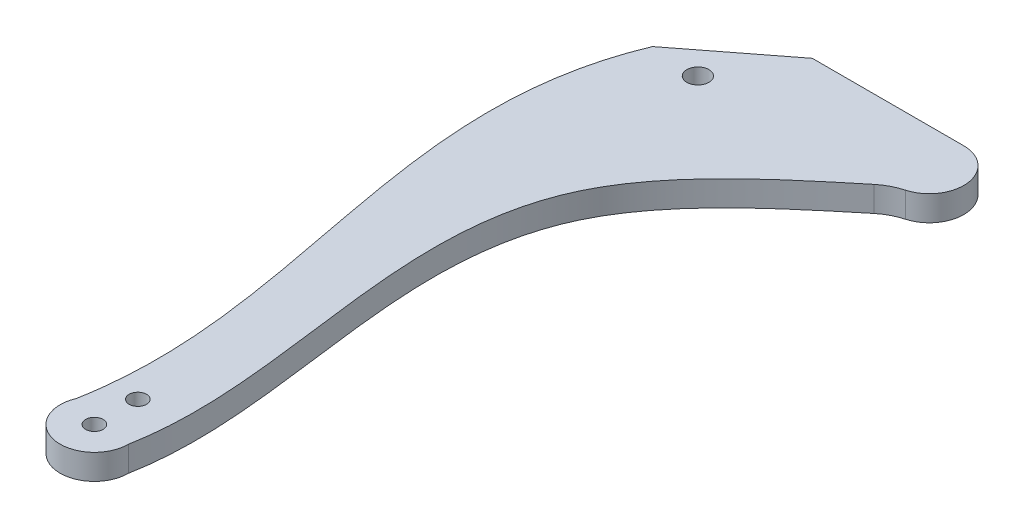
ISO-10303-21;
HEADER;
FILE_DESCRIPTION(('STEP AP214'),'2;1');
FILE_NAME('part.step','',(''),(''),'','','');
FILE_SCHEMA(('AUTOMOTIVE_DESIGN { 1 0 10303 214 1 1 1 1 }'));
ENDSEC;
DATA;
#1=APPLICATION_CONTEXT('core data for automotive mechanical design processes');
#2=APPLICATION_PROTOCOL_DEFINITION('international standard','automotive_design',2000,#1);
#3=PRODUCT_CONTEXT('',#1,'mechanical');
#4=PRODUCT('Part','Part','',(#3));
#5=PRODUCT_RELATED_PRODUCT_CATEGORY('part','',(#4));
#6=PRODUCT_DEFINITION_FORMATION('','',#4);
#7=PRODUCT_DEFINITION_CONTEXT('part definition',#1,'design');
#8=PRODUCT_DEFINITION('design','',#6,#7);
#9=PRODUCT_DEFINITION_SHAPE('','',#8);
#10=(LENGTH_UNIT() NAMED_UNIT(*) SI_UNIT(.MILLI.,.METRE.));
#11=(NAMED_UNIT(*) PLANE_ANGLE_UNIT() SI_UNIT($,.RADIAN.));
#12=(NAMED_UNIT(*) SI_UNIT($,.STERADIAN.) SOLID_ANGLE_UNIT());
#13=UNCERTAINTY_MEASURE_WITH_UNIT(LENGTH_MEASURE(1.E-05),#10,'distance_accuracy_value','');
#14=(GEOMETRIC_REPRESENTATION_CONTEXT(3) GLOBAL_UNCERTAINTY_ASSIGNED_CONTEXT((#13)) GLOBAL_UNIT_ASSIGNED_CONTEXT((#10,
#11,#12)) REPRESENTATION_CONTEXT('',''));
#15=CARTESIAN_POINT('',(0.,0.,0.));
#16=DIRECTION('',(0.,0.,1.));
#17=DIRECTION('',(1.,0.,0.));
#18=AXIS2_PLACEMENT_3D('',#15,#16,#17);
#19=CARTESIAN_POINT('',(-33.5800678442369,4.5,56.28156678213));
#20=DIRECTION('',(0.,-1.,0.));
#21=DIRECTION('',(0.,0.,-1.));
#22=AXIS2_PLACEMENT_3D('',#19,#20,#21);
#23=PLANE('',#22);
#24=CARTESIAN_POINT('',(-23.6205551146785,4.5,112.138995974269));
#25=DIRECTION('',(0.,1.,0.));
#26=DIRECTION('',(0.,0.,1.));
#27=AXIS2_PLACEMENT_3D('',#24,#25,#26);
#28=CIRCLE('',#27,1.554999938);
#29=CARTESIAN_POINT('',(-23.6205551146785,4.5,113.693995912269));
#30=VERTEX_POINT('',#29);
#31=EDGE_CURVE('E194',#30,#30,#28,.T.);
#32=ORIENTED_EDGE('',*,*,#31,.F.);
#33=EDGE_LOOP('',(#32));
#34=FACE_BOUND('',#33,.T.);
#35=DIRECTION('',(-0.79076812279447,0.,0.612115819083374));
#36=VECTOR('',#35,1.);
#37=CARTESIAN_POINT('',(-16.1448996631949,4.5,-8.4540032736779));
#38=LINE('',#37,#36);
#39=CARTESIAN_POINT('',(-16.1448996631949,4.5,-8.4540032736779));
#40=VERTEX_POINT('',#39);
#41=CARTESIAN_POINT('',(-32.217521916136,4.5,3.98745213098542));
#42=VERTEX_POINT('',#41);
#43=EDGE_CURVE('E147',#40,#42,#38,.T.);
#44=ORIENTED_EDGE('',*,*,#43,.T.);
#45=CARTESIAN_POINT('',(-32.217521916136,4.5,3.98745213098542));
#46=CARTESIAN_POINT('',(-42.2065149060718,4.5,27.8278205053542));
#47=CARTESIAN_POINT('',(-29.5613701153101,4.5,63.9822503451925));
#48=CARTESIAN_POINT('',(-27.3901690543069,4.5,99.6650419871978));
#49=CARTESIAN_POINT('',(-29.2394941851879,4.5,109.757437382177));
#50=B_SPLINE_CURVE_WITH_KNOTS('',3,(#45,#46,#47,#48,#49),.UNSPECIFIED.,.F.,.F.,(4,1,4),(0.,
0.696305278791168,0.977824200877543),.UNSPECIFIED.);
#51=CARTESIAN_POINT('',(-29.2394941851879,4.5,109.757437382177));
#52=VERTEX_POINT('',#51);
#53=EDGE_CURVE('E90',#42,#52,#50,.T.);
#54=ORIENTED_EDGE('',*,*,#53,.T.);
#55=CARTESIAN_POINT('',(-23.6205551146785,4.5,112.138995974269));
#56=DIRECTION('',(0.,1.,0.));
#57=DIRECTION('',(0.,0.,1.));
#58=AXIS2_PLACEMENT_3D('',#55,#56,#57);
#59=CIRCLE('',#58,6.10281063164049);
#60=CARTESIAN_POINT('',(-17.517744483038,4.5,112.138995974269));
#61=VERTEX_POINT('',#60);
#62=EDGE_CURVE('E159',#52,#61,#59,.T.);
#63=ORIENTED_EDGE('',*,*,#62,.T.);
#64=CARTESIAN_POINT('',(-17.517744483038,4.5,112.138995974269));
#65=CARTESIAN_POINT('',(-12.8946829626533,4.5,87.3265466424668));
#66=CARTESIAN_POINT('',(-31.4890867813224,4.5,46.9437900593647));
#67=CARTESIAN_POINT('',(-4.6960452827572,4.5,16.5858685499804));
#68=CARTESIAN_POINT('',(4.93253274399876,4.5,8.71883291305758));
#69=CARTESIAN_POINT('',(8.82409988389271,4.5,5.51846179454827));
#70=B_SPLINE_CURVE_WITH_KNOTS('',3,(#64,#65,#66,#67,#68,#69),.UNSPECIFIED.,.F.,.F.,(4,1,1,4),
(0.0234781084162324,0.692645434763002,0.868534101728694,1.),.UNSPECIFIED.);
#71=CARTESIAN_POINT('',(8.82409988389271,4.5,5.51846179454826));
#72=VERTEX_POINT('',#71);
#73=EDGE_CURVE('E106',#61,#72,#70,.T.);
#74=ORIENTED_EDGE('',*,*,#73,.T.);
#75=CARTESIAN_POINT('',(15.1759095054056,4.5,13.2420953003573));
#76=DIRECTION('',(0.,-1.,0.));
#77=DIRECTION('',(0.,0.,1.));
#78=AXIS2_PLACEMENT_3D('',#75,#76,#77);
#79=CIRCLE('',#78,10.);
#80=CARTESIAN_POINT('',(12.5127720902824,4.5,3.60323130566523));
#81=VERTEX_POINT('',#80);
#82=EDGE_CURVE('E100',#72,#81,#79,.T.);
#83=ORIENTED_EDGE('',*,*,#82,.T.);
#84=CARTESIAN_POINT('',(10.8777451080779,4.5,-2.31452668144633));
#85=DIRECTION('',(0.,1.,0.));
#86=DIRECTION('',(0.,0.,1.));
#87=AXIS2_PLACEMENT_3D('',#84,#85,#86);
#88=CIRCLE('',#87,6.13947659223157);
#89=CARTESIAN_POINT('',(10.8777451080779,4.5,-8.4540032736779));
#90=VERTEX_POINT('',#89);
#91=EDGE_CURVE('E104',#81,#90,#88,.T.);
#92=ORIENTED_EDGE('',*,*,#91,.T.);
#93=DIRECTION('',(-1.,0.,0.));
#94=VECTOR('',#93,1.);
#95=CARTESIAN_POINT('',(-16.1448996631949,4.5,-8.4540032736779));
#96=LINE('',#95,#94);
#97=EDGE_CURVE('E50',#90,#40,#96,.T.);
#98=ORIENTED_EDGE('',*,*,#97,.T.);
#99=EDGE_LOOP('',(#44,#54,#63,#74,#83,#92,#98));
#100=FACE_BOUND('',#99,.T.);
#101=CARTESIAN_POINT('',(-23.6205551146785,4.5,4.47899590226864));
#102=DIRECTION('',(0.,1.,0.));
#103=DIRECTION('',(0.,0.,1.));
#104=AXIS2_PLACEMENT_3D('',#101,#102,#103);
#105=CIRCLE('',#104,1.97500000000001);
#106=CARTESIAN_POINT('',(-23.6205551146785,4.5,6.45399590226865));
#107=VERTEX_POINT('',#106);
#108=EDGE_CURVE('E128',#107,#107,#105,.T.);
#109=ORIENTED_EDGE('',*,*,#108,.F.);
#110=EDGE_LOOP('',(#109));
#111=FACE_BOUND('',#110,.T.);
#112=CARTESIAN_POINT('',(-23.6205551146785,4.5,104.378996000269));
#113=DIRECTION('',(0.,1.,0.));
#114=DIRECTION('',(0.,0.,1.));
#115=AXIS2_PLACEMENT_3D('',#112,#113,#114);
#116=CIRCLE('',#115,1.554999938);
#117=CARTESIAN_POINT('',(-23.6205551146785,4.5,105.933995938269));
#118=VERTEX_POINT('',#117);
#119=EDGE_CURVE('E200',#118,#118,#116,.T.);
#120=ORIENTED_EDGE('',*,*,#119,.F.);
#121=EDGE_LOOP('',(#120));
#122=FACE_BOUND('',#121,.T.);
#123=ADVANCED_FACE('F33',(#34,#100,#111,#122),#23,.F.);
#124=CARTESIAN_POINT('',(-33.5800678442369,0.,56.28156678213));
#125=DIRECTION('',(0.,-1.,0.));
#126=DIRECTION('',(0.,0.,-1.));
#127=AXIS2_PLACEMENT_3D('',#124,#125,#126);
#128=PLANE('',#127);
#129=CARTESIAN_POINT('',(-23.6205551146785,0.,112.138995974269));
#130=DIRECTION('',(0.,1.,0.));
#131=DIRECTION('',(0.,0.,1.));
#132=AXIS2_PLACEMENT_3D('',#129,#130,#131);
#133=CIRCLE('',#132,1.554999938);
#134=CARTESIAN_POINT('',(-23.6205551146785,0.,113.693995912269));
#135=VERTEX_POINT('',#134);
#136=EDGE_CURVE('E197',#135,#135,#133,.T.);
#137=ORIENTED_EDGE('',*,*,#136,.T.);
#138=EDGE_LOOP('',(#137));
#139=FACE_BOUND('',#138,.T.);
#140=DIRECTION('',(-0.79076812279447,0.,0.612115819083374));
#141=VECTOR('',#140,1.);
#142=CARTESIAN_POINT('',(-16.1448996631949,0.,-8.4540032736779));
#143=LINE('',#142,#141);
#144=CARTESIAN_POINT('',(-16.1448996631949,0.,-8.4540032736779));
#145=VERTEX_POINT('',#144);
#146=CARTESIAN_POINT('',(-32.217521916136,0.,3.98745213098542));
#147=VERTEX_POINT('',#146);
#148=EDGE_CURVE('E124',#145,#147,#143,.T.);
#149=ORIENTED_EDGE('',*,*,#148,.F.);
#150=DIRECTION('',(-1.,0.,0.));
#151=VECTOR('',#150,1.);
#152=CARTESIAN_POINT('',(-16.1448996631949,0.,-8.4540032736779));
#153=LINE('',#152,#151);
#154=CARTESIAN_POINT('',(10.8777451080779,0.,-8.4540032736779));
#155=VERTEX_POINT('',#154);
#156=EDGE_CURVE('E82',#155,#145,#153,.T.);
#157=ORIENTED_EDGE('',*,*,#156,.F.);
#158=CARTESIAN_POINT('',(10.8777451080779,0.,-2.31452668144633));
#159=DIRECTION('',(0.,1.,0.));
#160=DIRECTION('',(0.,0.,1.));
#161=AXIS2_PLACEMENT_3D('',#158,#159,#160);
#162=CIRCLE('',#161,6.13947659223157);
#163=CARTESIAN_POINT('',(12.5127720902824,0.,3.60323130566523));
#164=VERTEX_POINT('',#163);
#165=EDGE_CURVE('E76',#164,#155,#162,.T.);
#166=ORIENTED_EDGE('',*,*,#165,.F.);
#167=CARTESIAN_POINT('',(15.1759095054056,0.,13.2420953003573));
#168=DIRECTION('',(0.,-1.,0.));
#169=DIRECTION('',(0.,0.,1.));
#170=AXIS2_PLACEMENT_3D('',#167,#168,#169);
#171=CIRCLE('',#170,10.);
#172=CARTESIAN_POINT('',(8.82409988389271,0.,5.51846179454826));
#173=VERTEX_POINT('',#172);
#174=EDGE_CURVE('E114',#173,#164,#171,.T.);
#175=ORIENTED_EDGE('',*,*,#174,.F.);
#176=CARTESIAN_POINT('',(-17.517744483038,0.,112.138995974269));
#177=CARTESIAN_POINT('',(-12.8946829626533,0.,87.3265466424668));
#178=CARTESIAN_POINT('',(-31.4890867813224,0.,46.9437900593647));
#179=CARTESIAN_POINT('',(-4.6960452827572,0.,16.5858685499804));
#180=CARTESIAN_POINT('',(4.93253274399876,0.,8.71883291305758));
#181=CARTESIAN_POINT('',(8.82409988389271,0.,5.51846179454827));
#182=B_SPLINE_CURVE_WITH_KNOTS('',3,(#176,#177,#178,#179,#180,#181),.UNSPECIFIED.,.F.,.F.,(4,1,
1,4),(0.0234781084162324,0.692645434763002,0.868534101728694,1.),.UNSPECIFIED.);
#183=CARTESIAN_POINT('',(-17.517744483038,0.,112.138995974269));
#184=VERTEX_POINT('',#183);
#185=EDGE_CURVE('E137',#184,#173,#182,.T.);
#186=ORIENTED_EDGE('',*,*,#185,.F.);
#187=CARTESIAN_POINT('',(-23.6205551146785,0.,112.138995974269));
#188=DIRECTION('',(0.,1.,0.));
#189=DIRECTION('',(0.,0.,1.));
#190=AXIS2_PLACEMENT_3D('',#187,#188,#189);
#191=CIRCLE('',#190,6.10281063164049);
#192=CARTESIAN_POINT('',(-29.2394941851879,0.,109.757437382177));
#193=VERTEX_POINT('',#192);
#194=EDGE_CURVE('E132',#193,#184,#191,.T.);
#195=ORIENTED_EDGE('',*,*,#194,.F.);
#196=CARTESIAN_POINT('',(-32.217521916136,0.,3.98745213098542));
#197=CARTESIAN_POINT('',(-42.2065149060718,0.,27.8278205053542));
#198=CARTESIAN_POINT('',(-29.5613701153101,0.,63.9822503451925));
#199=CARTESIAN_POINT('',(-27.3901690543069,0.,99.6650419871978));
#200=CARTESIAN_POINT('',(-29.2394941851879,0.,109.757437382177));
#201=B_SPLINE_CURVE_WITH_KNOTS('',3,(#196,#197,#198,#199,#200),.UNSPECIFIED.,.F.,.F.,(4,1,4),
(0.,0.696305278791168,0.977824200877543),.UNSPECIFIED.);
#202=EDGE_CURVE('E127',#147,#193,#201,.T.);
#203=ORIENTED_EDGE('',*,*,#202,.F.);
#204=EDGE_LOOP('',(#149,#157,#166,#175,#186,#195,#203));
#205=FACE_BOUND('',#204,.T.);
#206=CARTESIAN_POINT('',(-23.6205551146785,0.,4.47899590226864));
#207=DIRECTION('',(0.,1.,0.));
#208=DIRECTION('',(0.,0.,1.));
#209=AXIS2_PLACEMENT_3D('',#206,#207,#208);
#210=CIRCLE('',#209,1.97500000000001);
#211=CARTESIAN_POINT('',(-23.6205551146785,0.,6.45399590226865));
#212=VERTEX_POINT('',#211);
#213=EDGE_CURVE('E191',#212,#212,#210,.T.);
#214=ORIENTED_EDGE('',*,*,#213,.T.);
#215=EDGE_LOOP('',(#214));
#216=FACE_BOUND('',#215,.T.);
#217=CARTESIAN_POINT('',(-23.6205551146785,0.,104.378996000269));
#218=DIRECTION('',(0.,1.,0.));
#219=DIRECTION('',(0.,0.,1.));
#220=AXIS2_PLACEMENT_3D('',#217,#218,#219);
#221=CIRCLE('',#220,1.554999938);
#222=CARTESIAN_POINT('',(-23.6205551146785,0.,105.933995938269));
#223=VERTEX_POINT('',#222);
#224=EDGE_CURVE('E203',#223,#223,#221,.T.);
#225=ORIENTED_EDGE('',*,*,#224,.T.);
#226=EDGE_LOOP('',(#225));
#227=FACE_BOUND('',#226,.T.);
#228=ADVANCED_FACE('F163',(#139,#205,#216,#227),#128,.T.);
#229=CARTESIAN_POINT('',(-16.1448996631949,4.5,-8.4540032736779));
#230=DIRECTION('',(0.612115819083374,0.,0.79076812279447));
#231=DIRECTION('',(0.79076812279447,0.,-0.612115819083374));
#232=AXIS2_PLACEMENT_3D('',#229,#230,#231);
#233=PLANE('',#232);
#234=ORIENTED_EDGE('',*,*,#148,.T.);
#235=DIRECTION('',(0.,-1.,0.));
#236=VECTOR('',#235,1.);
#237=CARTESIAN_POINT('',(-32.217521916136,4.5,3.98745213098542));
#238=LINE('',#237,#236);
#239=EDGE_CURVE('E11',#42,#147,#238,.T.);
#240=ORIENTED_EDGE('',*,*,#239,.F.);
#241=ORIENTED_EDGE('',*,*,#43,.F.);
#242=DIRECTION('',(0.,-1.,0.));
#243=VECTOR('',#242,1.);
#244=CARTESIAN_POINT('',(-16.1448996631949,4.5,-8.4540032736779));
#245=LINE('',#244,#243);
#246=EDGE_CURVE('E120',#40,#145,#245,.T.);
#247=ORIENTED_EDGE('',*,*,#246,.T.);
#248=EDGE_LOOP('',(#234,#240,#241,#247));
#249=FACE_BOUND('',#248,.T.);
#250=ADVANCED_FACE('F35',(#249),#233,.F.);
#251=DIRECTION('',(0.,-1.,0.));
#252=VECTOR('',#251,1.);
#253=SURFACE_OF_LINEAR_EXTRUSION('',#50,#252);
#254=ORIENTED_EDGE('',*,*,#202,.T.);
#255=DIRECTION('',(0.,-1.,0.));
#256=VECTOR('',#255,1.);
#257=CARTESIAN_POINT('',(-29.2394941851879,4.5,109.757437382177));
#258=LINE('',#257,#256);
#259=EDGE_CURVE('E42',#52,#193,#258,.T.);
#260=ORIENTED_EDGE('',*,*,#259,.F.);
#261=ORIENTED_EDGE('',*,*,#53,.F.);
#262=ORIENTED_EDGE('',*,*,#239,.T.);
#263=EDGE_LOOP('',(#254,#260,#261,#262));
#264=FACE_BOUND('',#263,.T.);
#265=ADVANCED_FACE('F181',(#264),#253,.F.);
#266=CARTESIAN_POINT('',(-23.6205551146785,4.5,112.138995974269));
#267=DIRECTION('',(0.,-1.,0.));
#268=DIRECTION('',(0.,0.,-1.));
#269=AXIS2_PLACEMENT_3D('',#266,#267,#268);
#270=CYLINDRICAL_SURFACE('',#269,6.10281063164049);
#271=ORIENTED_EDGE('',*,*,#194,.T.);
#272=DIRECTION('',(0.,-1.,0.));
#273=VECTOR('',#272,1.);
#274=CARTESIAN_POINT('',(-17.517744483038,4.5,112.138995974269));
#275=LINE('',#274,#273);
#276=EDGE_CURVE('E151',#61,#184,#275,.T.);
#277=ORIENTED_EDGE('',*,*,#276,.F.);
#278=ORIENTED_EDGE('',*,*,#62,.F.);
#279=ORIENTED_EDGE('',*,*,#259,.T.);
#280=EDGE_LOOP('',(#271,#277,#278,#279));
#281=FACE_BOUND('',#280,.T.);
#282=ADVANCED_FACE('F157',(#281),#270,.T.);
#283=DIRECTION('',(0.,-1.,0.));
#284=VECTOR('',#283,1.);
#285=SURFACE_OF_LINEAR_EXTRUSION('',#70,#284);
#286=ORIENTED_EDGE('',*,*,#185,.T.);
#287=DIRECTION('',(0.,-1.,0.));
#288=VECTOR('',#287,1.);
#289=CARTESIAN_POINT('',(8.82409988389271,4.5,5.51846179454826));
#290=LINE('',#289,#288);
#291=EDGE_CURVE('E115',#72,#173,#290,.T.);
#292=ORIENTED_EDGE('',*,*,#291,.F.);
#293=ORIENTED_EDGE('',*,*,#73,.F.);
#294=ORIENTED_EDGE('',*,*,#276,.T.);
#295=EDGE_LOOP('',(#286,#292,#293,#294));
#296=FACE_BOUND('',#295,.T.);
#297=ADVANCED_FACE('F166',(#296),#285,.F.);
#298=CARTESIAN_POINT('',(15.1759095054056,4.5,13.2420953003573));
#299=DIRECTION('',(0.,-1.,0.));
#300=DIRECTION('',(0.,0.,-1.));
#301=AXIS2_PLACEMENT_3D('',#298,#299,#300);
#302=CYLINDRICAL_SURFACE('',#301,10.);
#303=ORIENTED_EDGE('',*,*,#174,.T.);
#304=DIRECTION('',(0.,-1.,0.));
#305=VECTOR('',#304,1.);
#306=CARTESIAN_POINT('',(12.5127720902824,4.5,3.60323130566523));
#307=LINE('',#306,#305);
#308=EDGE_CURVE('E111',#81,#164,#307,.T.);
#309=ORIENTED_EDGE('',*,*,#308,.F.);
#310=ORIENTED_EDGE('',*,*,#82,.F.);
#311=ORIENTED_EDGE('',*,*,#291,.T.);
#312=EDGE_LOOP('',(#303,#309,#310,#311));
#313=FACE_BOUND('',#312,.T.);
#314=ADVANCED_FACE('F112',(#313),#302,.F.);
#315=CARTESIAN_POINT('',(10.8777451080779,4.5,-2.31452668144633));
#316=DIRECTION('',(0.,-1.,0.));
#317=DIRECTION('',(0.,0.,-1.));
#318=AXIS2_PLACEMENT_3D('',#315,#316,#317);
#319=CYLINDRICAL_SURFACE('',#318,6.13947659223157);
#320=ORIENTED_EDGE('',*,*,#165,.T.);
#321=DIRECTION('',(0.,-1.,0.));
#322=VECTOR('',#321,1.);
#323=CARTESIAN_POINT('',(10.8777451080779,4.5,-8.4540032736779));
#324=LINE('',#323,#322);
#325=EDGE_CURVE('E116',#90,#155,#324,.T.);
#326=ORIENTED_EDGE('',*,*,#325,.F.);
#327=ORIENTED_EDGE('',*,*,#91,.F.);
#328=ORIENTED_EDGE('',*,*,#308,.T.);
#329=EDGE_LOOP('',(#320,#326,#327,#328));
#330=FACE_BOUND('',#329,.T.);
#331=ADVANCED_FACE('F118',(#330),#319,.T.);
#332=CARTESIAN_POINT('',(-16.1448996631949,4.5,-8.4540032736779));
#333=DIRECTION('',(0.,0.,1.));
#334=DIRECTION('',(1.,0.,0.));
#335=AXIS2_PLACEMENT_3D('',#332,#333,#334);
#336=PLANE('',#335);
#337=ORIENTED_EDGE('',*,*,#156,.T.);
#338=ORIENTED_EDGE('',*,*,#246,.F.);
#339=ORIENTED_EDGE('',*,*,#97,.F.);
#340=ORIENTED_EDGE('',*,*,#325,.T.);
#341=EDGE_LOOP('',(#337,#338,#339,#340));
#342=FACE_BOUND('',#341,.T.);
#343=ADVANCED_FACE('F225',(#342),#336,.F.);
#344=CARTESIAN_POINT('',(-23.6205551146785,4.5,4.47899590226864));
#345=DIRECTION('',(0.,-1.,0.));
#346=DIRECTION('',(0.,0.,-1.));
#347=AXIS2_PLACEMENT_3D('',#344,#345,#346);
#348=CYLINDRICAL_SURFACE('',#347,1.97500000000001);
#349=ORIENTED_EDGE('',*,*,#108,.T.);
#350=EDGE_LOOP('',(#349));
#351=FACE_BOUND('',#350,.T.);
#352=ORIENTED_EDGE('',*,*,#213,.F.);
#353=EDGE_LOOP('',(#352));
#354=FACE_BOUND('',#353,.T.);
#355=ADVANCED_FACE('F222',(#351,#354),#348,.F.);
#356=CARTESIAN_POINT('',(-23.6205551146785,4.5,112.138995974269));
#357=DIRECTION('',(0.,-1.,0.));
#358=DIRECTION('',(0.,0.,-1.));
#359=AXIS2_PLACEMENT_3D('',#356,#357,#358);
#360=CYLINDRICAL_SURFACE('',#359,1.554999938);
#361=ORIENTED_EDGE('',*,*,#31,.T.);
#362=EDGE_LOOP('',(#361));
#363=FACE_BOUND('',#362,.T.);
#364=ORIENTED_EDGE('',*,*,#136,.F.);
#365=EDGE_LOOP('',(#364));
#366=FACE_BOUND('',#365,.T.);
#367=ADVANCED_FACE('F288',(#363,#366),#360,.F.);
#368=CARTESIAN_POINT('',(-23.6205551146785,4.5,104.378996000269));
#369=DIRECTION('',(0.,-1.,0.));
#370=DIRECTION('',(0.,0.,-1.));
#371=AXIS2_PLACEMENT_3D('',#368,#369,#370);
#372=CYLINDRICAL_SURFACE('',#371,1.554999938);
#373=ORIENTED_EDGE('',*,*,#119,.T.);
#374=EDGE_LOOP('',(#373));
#375=FACE_BOUND('',#374,.T.);
#376=ORIENTED_EDGE('',*,*,#224,.F.);
#377=EDGE_LOOP('',(#376));
#378=FACE_BOUND('',#377,.T.);
#379=ADVANCED_FACE('F209',(#375,#378),#372,.F.);
#380=CLOSED_SHELL('',(#123,#228,#250,#265,#282,#297,#314,#331,#343,#355,#367,#379));
#381=MANIFOLD_SOLID_BREP('B2',#380);
#382=ADVANCED_BREP_SHAPE_REPRESENTATION('',(#18,#381),#14);
#383=SHAPE_DEFINITION_REPRESENTATION(#9,#382);
ENDSEC;
END-ISO-10303-21;
